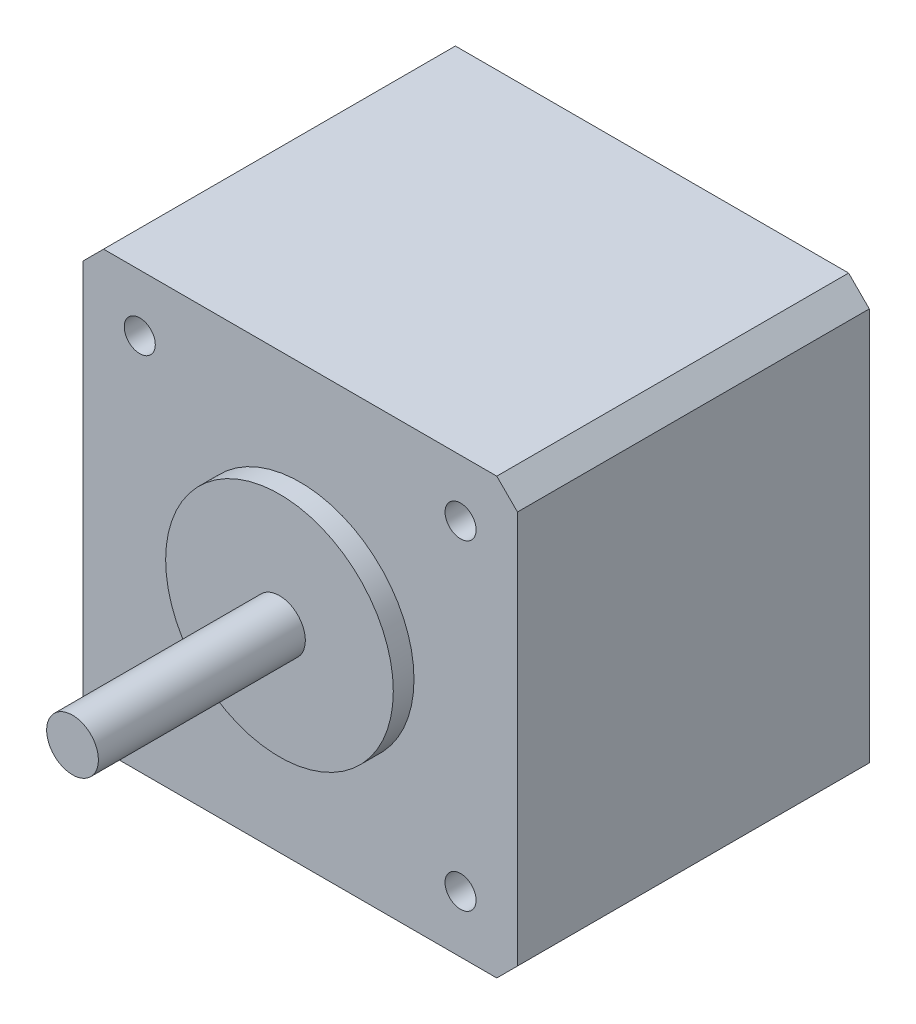
ISO-10303-21;
HEADER;
FILE_DESCRIPTION(('STEP AP214'),'2;1');
FILE_NAME('part.step','',(''),(''),'','','');
FILE_SCHEMA(('AUTOMOTIVE_DESIGN { 1 0 10303 214 1 1 1 1 }'));
ENDSEC;
DATA;
#1=APPLICATION_CONTEXT('core data for automotive mechanical design processes');
#2=APPLICATION_PROTOCOL_DEFINITION('international standard','automotive_design',2000,#1);
#3=PRODUCT_CONTEXT('',#1,'mechanical');
#4=PRODUCT('Part','Part','',(#3));
#5=PRODUCT_RELATED_PRODUCT_CATEGORY('part','',(#4));
#6=PRODUCT_DEFINITION_FORMATION('','',#4);
#7=PRODUCT_DEFINITION_CONTEXT('part definition',#1,'design');
#8=PRODUCT_DEFINITION('design','',#6,#7);
#9=PRODUCT_DEFINITION_SHAPE('','',#8);
#10=(LENGTH_UNIT() NAMED_UNIT(*) SI_UNIT(.MILLI.,.METRE.));
#11=(NAMED_UNIT(*) PLANE_ANGLE_UNIT() SI_UNIT($,.RADIAN.));
#12=(NAMED_UNIT(*) SI_UNIT($,.STERADIAN.) SOLID_ANGLE_UNIT());
#13=UNCERTAINTY_MEASURE_WITH_UNIT(LENGTH_MEASURE(1.E-05),#10,'distance_accuracy_value','');
#14=(GEOMETRIC_REPRESENTATION_CONTEXT(3) GLOBAL_UNCERTAINTY_ASSIGNED_CONTEXT((#13)) GLOBAL_UNIT_ASSIGNED_CONTEXT((#10,
#11,#12)) REPRESENTATION_CONTEXT('',''));
#15=CARTESIAN_POINT('',(0.,0.,0.));
#16=DIRECTION('',(0.,0.,1.));
#17=DIRECTION('',(1.,0.,0.));
#18=AXIS2_PLACEMENT_3D('',#15,#16,#17);
#19=CARTESIAN_POINT('',(21.,0.,-34.));
#20=DIRECTION('',(-1.,0.,0.));
#21=DIRECTION('',(0.,-1.,0.));
#22=AXIS2_PLACEMENT_3D('',#19,#20,#21);
#23=PLANE('',#22);
#24=DIRECTION('',(0.,-1.,0.));
#25=VECTOR('',#24,1.);
#26=CARTESIAN_POINT('',(21.,0.,-34.));
#27=LINE('',#26,#25);
#28=CARTESIAN_POINT('',(21.,19.,-34.));
#29=VERTEX_POINT('',#28);
#30=CARTESIAN_POINT('',(21.,-19.,-34.));
#31=VERTEX_POINT('',#30);
#32=EDGE_CURVE('E176',#29,#31,#27,.T.);
#33=ORIENTED_EDGE('',*,*,#32,.F.);
#34=DIRECTION('',(0.,0.,1.));
#35=VECTOR('',#34,1.);
#36=CARTESIAN_POINT('',(21.,19.,-34.));
#37=LINE('',#36,#35);
#38=CARTESIAN_POINT('',(21.,19.,0.));
#39=VERTEX_POINT('',#38);
#40=EDGE_CURVE('E170',#29,#39,#37,.T.);
#41=ORIENTED_EDGE('',*,*,#40,.T.);
#42=DIRECTION('',(0.,-1.,0.));
#43=VECTOR('',#42,1.);
#44=CARTESIAN_POINT('',(21.,0.,0.));
#45=LINE('',#44,#43);
#46=CARTESIAN_POINT('',(21.,-19.,0.));
#47=VERTEX_POINT('',#46);
#48=EDGE_CURVE('E135',#39,#47,#45,.T.);
#49=ORIENTED_EDGE('',*,*,#48,.T.);
#50=DIRECTION('',(0.,0.,-1.));
#51=VECTOR('',#50,1.);
#52=CARTESIAN_POINT('',(21.,-19.,-34.));
#53=LINE('',#52,#51);
#54=EDGE_CURVE('E168',#47,#31,#53,.T.);
#55=ORIENTED_EDGE('',*,*,#54,.T.);
#56=EDGE_LOOP('',(#33,#41,#49,#55));
#57=FACE_BOUND('',#56,.T.);
#58=ADVANCED_FACE('F41',(#57),#23,.F.);
#59=CARTESIAN_POINT('',(0.,-21.,-34.));
#60=DIRECTION('',(0.,-1.,0.));
#61=DIRECTION('',(0.,0.,-1.));
#62=AXIS2_PLACEMENT_3D('',#59,#60,#61);
#63=PLANE('',#62);
#64=DIRECTION('',(1.,0.,0.));
#65=VECTOR('',#64,1.);
#66=CARTESIAN_POINT('',(0.,-21.,-34.));
#67=LINE('',#66,#65);
#68=CARTESIAN_POINT('',(-19.,-21.,-34.));
#69=VERTEX_POINT('',#68);
#70=CARTESIAN_POINT('',(19.,-21.,-34.));
#71=VERTEX_POINT('',#70);
#72=EDGE_CURVE('E152',#69,#71,#67,.T.);
#73=ORIENTED_EDGE('',*,*,#72,.T.);
#74=DIRECTION('',(0.,0.,1.));
#75=VECTOR('',#74,1.);
#76=CARTESIAN_POINT('',(19.,-21.,0.));
#77=LINE('',#76,#75);
#78=CARTESIAN_POINT('',(19.,-21.,0.));
#79=VERTEX_POINT('',#78);
#80=EDGE_CURVE('E11',#71,#79,#77,.T.);
#81=ORIENTED_EDGE('',*,*,#80,.T.);
#82=DIRECTION('',(1.,0.,0.));
#83=VECTOR('',#82,1.);
#84=CARTESIAN_POINT('',(0.,-21.,0.));
#85=LINE('',#84,#83);
#86=CARTESIAN_POINT('',(-19.,-21.,0.));
#87=VERTEX_POINT('',#86);
#88=EDGE_CURVE('E137',#87,#79,#85,.T.);
#89=ORIENTED_EDGE('',*,*,#88,.F.);
#90=DIRECTION('',(0.,0.,-1.));
#91=VECTOR('',#90,1.);
#92=CARTESIAN_POINT('',(-19.,-21.,-34.));
#93=LINE('',#92,#91);
#94=EDGE_CURVE('E50',#87,#69,#93,.T.);
#95=ORIENTED_EDGE('',*,*,#94,.T.);
#96=EDGE_LOOP('',(#73,#81,#89,#95));
#97=FACE_BOUND('',#96,.T.);
#98=ADVANCED_FACE('F182',(#97),#63,.T.);
#99=CARTESIAN_POINT('',(-21.,0.,-34.));
#100=DIRECTION('',(-1.,0.,0.));
#101=DIRECTION('',(0.,-1.,0.));
#102=AXIS2_PLACEMENT_3D('',#99,#100,#101);
#103=PLANE('',#102);
#104=DIRECTION('',(0.,-1.,0.));
#105=VECTOR('',#104,1.);
#106=CARTESIAN_POINT('',(-21.,0.,0.));
#107=LINE('',#106,#105);
#108=CARTESIAN_POINT('',(-21.,19.,0.));
#109=VERTEX_POINT('',#108);
#110=CARTESIAN_POINT('',(-21.,-19.,0.));
#111=VERTEX_POINT('',#110);
#112=EDGE_CURVE('E134',#109,#111,#107,.T.);
#113=ORIENTED_EDGE('',*,*,#112,.F.);
#114=DIRECTION('',(0.,0.,-1.));
#115=VECTOR('',#114,1.);
#116=CARTESIAN_POINT('',(-21.,19.,-34.));
#117=LINE('',#116,#115);
#118=CARTESIAN_POINT('',(-21.,19.,-34.));
#119=VERTEX_POINT('',#118);
#120=EDGE_CURVE('E113',#109,#119,#117,.T.);
#121=ORIENTED_EDGE('',*,*,#120,.T.);
#122=DIRECTION('',(0.,-1.,0.));
#123=VECTOR('',#122,1.);
#124=CARTESIAN_POINT('',(-21.,0.,-34.));
#125=LINE('',#124,#123);
#126=CARTESIAN_POINT('',(-21.,-19.,-34.));
#127=VERTEX_POINT('',#126);
#128=EDGE_CURVE('E184',#119,#127,#125,.T.);
#129=ORIENTED_EDGE('',*,*,#128,.T.);
#130=DIRECTION('',(0.,0.,1.));
#131=VECTOR('',#130,1.);
#132=CARTESIAN_POINT('',(-21.,-19.,-34.));
#133=LINE('',#132,#131);
#134=EDGE_CURVE('E118',#127,#111,#133,.T.);
#135=ORIENTED_EDGE('',*,*,#134,.T.);
#136=EDGE_LOOP('',(#113,#121,#129,#135));
#137=FACE_BOUND('',#136,.T.);
#138=ADVANCED_FACE('F226',(#137),#103,.T.);
#139=CARTESIAN_POINT('',(15.5,15.5,-34.));
#140=DIRECTION('',(0.,0.,1.));
#141=DIRECTION('',(1.,0.,0.));
#142=AXIS2_PLACEMENT_3D('',#139,#140,#141);
#143=CYLINDRICAL_SURFACE('',#142,1.5);
#144=CARTESIAN_POINT('',(15.5,15.5,-34.));
#145=DIRECTION('',(0.,0.,1.));
#146=DIRECTION('',(1.,0.,0.));
#147=AXIS2_PLACEMENT_3D('',#144,#145,#146);
#148=CIRCLE('',#147,1.5);
#149=CARTESIAN_POINT('',(17.,15.5,-34.));
#150=VERTEX_POINT('',#149);
#151=EDGE_CURVE('E434',#150,#150,#148,.T.);
#152=ORIENTED_EDGE('',*,*,#151,.F.);
#153=EDGE_LOOP('',(#152));
#154=FACE_BOUND('',#153,.T.);
#155=CARTESIAN_POINT('',(15.5,15.5,0.));
#156=DIRECTION('',(0.,0.,1.));
#157=DIRECTION('',(1.,0.,0.));
#158=AXIS2_PLACEMENT_3D('',#155,#156,#157);
#159=CIRCLE('',#158,1.5);
#160=CARTESIAN_POINT('',(17.,15.5,0.));
#161=VERTEX_POINT('',#160);
#162=EDGE_CURVE('E140',#161,#161,#159,.T.);
#163=ORIENTED_EDGE('',*,*,#162,.T.);
#164=EDGE_LOOP('',(#163));
#165=FACE_BOUND('',#164,.T.);
#166=ADVANCED_FACE('F202',(#154,#165),#143,.F.);
#167=CARTESIAN_POINT('',(-15.5,15.5,-34.));
#168=DIRECTION('',(0.,0.,1.));
#169=DIRECTION('',(1.,0.,0.));
#170=AXIS2_PLACEMENT_3D('',#167,#168,#169);
#171=CYLINDRICAL_SURFACE('',#170,1.5);
#172=CARTESIAN_POINT('',(-15.5,15.5,-34.));
#173=DIRECTION('',(0.,0.,1.));
#174=DIRECTION('',(1.,0.,0.));
#175=AXIS2_PLACEMENT_3D('',#172,#173,#174);
#176=CIRCLE('',#175,1.5);
#177=CARTESIAN_POINT('',(-14.,15.5,-34.));
#178=VERTEX_POINT('',#177);
#179=EDGE_CURVE('E431',#178,#178,#176,.T.);
#180=ORIENTED_EDGE('',*,*,#179,.F.);
#181=EDGE_LOOP('',(#180));
#182=FACE_BOUND('',#181,.T.);
#183=CARTESIAN_POINT('',(-15.5,15.5,0.));
#184=DIRECTION('',(0.,0.,1.));
#185=DIRECTION('',(1.,0.,0.));
#186=AXIS2_PLACEMENT_3D('',#183,#184,#185);
#187=CIRCLE('',#186,1.5);
#188=CARTESIAN_POINT('',(-14.,15.5,0.));
#189=VERTEX_POINT('',#188);
#190=EDGE_CURVE('E197',#189,#189,#187,.T.);
#191=ORIENTED_EDGE('',*,*,#190,.T.);
#192=EDGE_LOOP('',(#191));
#193=FACE_BOUND('',#192,.T.);
#194=ADVANCED_FACE('F232',(#182,#193),#171,.F.);
#195=CARTESIAN_POINT('',(-15.5,-15.5,-34.));
#196=DIRECTION('',(0.,0.,1.));
#197=DIRECTION('',(1.,0.,0.));
#198=AXIS2_PLACEMENT_3D('',#195,#196,#197);
#199=CYLINDRICAL_SURFACE('',#198,1.5);
#200=CARTESIAN_POINT('',(-15.5,-15.5,-34.));
#201=DIRECTION('',(0.,0.,1.));
#202=DIRECTION('',(1.,0.,0.));
#203=AXIS2_PLACEMENT_3D('',#200,#201,#202);
#204=CIRCLE('',#203,1.5);
#205=CARTESIAN_POINT('',(-14.,-15.5,-34.));
#206=VERTEX_POINT('',#205);
#207=EDGE_CURVE('E428',#206,#206,#204,.T.);
#208=ORIENTED_EDGE('',*,*,#207,.F.);
#209=EDGE_LOOP('',(#208));
#210=FACE_BOUND('',#209,.T.);
#211=CARTESIAN_POINT('',(-15.5,-15.5,0.));
#212=DIRECTION('',(0.,0.,1.));
#213=DIRECTION('',(1.,0.,0.));
#214=AXIS2_PLACEMENT_3D('',#211,#212,#213);
#215=CIRCLE('',#214,1.5);
#216=CARTESIAN_POINT('',(-14.,-15.5,0.));
#217=VERTEX_POINT('',#216);
#218=EDGE_CURVE('E193',#217,#217,#215,.T.);
#219=ORIENTED_EDGE('',*,*,#218,.T.);
#220=EDGE_LOOP('',(#219));
#221=FACE_BOUND('',#220,.T.);
#222=ADVANCED_FACE('F236',(#210,#221),#199,.F.);
#223=CARTESIAN_POINT('',(15.5,-15.5,-34.));
#224=DIRECTION('',(0.,0.,1.));
#225=DIRECTION('',(1.,0.,0.));
#226=AXIS2_PLACEMENT_3D('',#223,#224,#225);
#227=CYLINDRICAL_SURFACE('',#226,1.5);
#228=CARTESIAN_POINT('',(15.5,-15.5,-34.));
#229=DIRECTION('',(0.,0.,1.));
#230=DIRECTION('',(1.,0.,0.));
#231=AXIS2_PLACEMENT_3D('',#228,#229,#230);
#232=CIRCLE('',#231,1.5);
#233=CARTESIAN_POINT('',(17.,-15.5,-34.));
#234=VERTEX_POINT('',#233);
#235=EDGE_CURVE('E146',#234,#234,#232,.T.);
#236=ORIENTED_EDGE('',*,*,#235,.F.);
#237=EDGE_LOOP('',(#236));
#238=FACE_BOUND('',#237,.T.);
#239=CARTESIAN_POINT('',(15.5,-15.5,0.));
#240=DIRECTION('',(0.,0.,1.));
#241=DIRECTION('',(1.,0.,0.));
#242=AXIS2_PLACEMENT_3D('',#239,#240,#241);
#243=CIRCLE('',#242,1.5);
#244=CARTESIAN_POINT('',(17.,-15.5,0.));
#245=VERTEX_POINT('',#244);
#246=EDGE_CURVE('E190',#245,#245,#243,.T.);
#247=ORIENTED_EDGE('',*,*,#246,.T.);
#248=EDGE_LOOP('',(#247));
#249=FACE_BOUND('',#248,.T.);
#250=ADVANCED_FACE('F240',(#238,#249),#227,.F.);
#251=CARTESIAN_POINT('',(0.,21.,-34.));
#252=DIRECTION('',(0.,-1.,0.));
#253=DIRECTION('',(0.,0.,-1.));
#254=AXIS2_PLACEMENT_3D('',#251,#252,#253);
#255=PLANE('',#254);
#256=DIRECTION('',(1.,0.,0.));
#257=VECTOR('',#256,1.);
#258=CARTESIAN_POINT('',(0.,21.,-34.));
#259=LINE('',#258,#257);
#260=CARTESIAN_POINT('',(-19.,21.,-34.));
#261=VERTEX_POINT('',#260);
#262=CARTESIAN_POINT('',(19.,21.,-34.));
#263=VERTEX_POINT('',#262);
#264=EDGE_CURVE('E128',#261,#263,#259,.T.);
#265=ORIENTED_EDGE('',*,*,#264,.F.);
#266=DIRECTION('',(0.,0.,1.));
#267=VECTOR('',#266,1.);
#268=CARTESIAN_POINT('',(-19.,21.,0.));
#269=LINE('',#268,#267);
#270=CARTESIAN_POINT('',(-19.,21.,0.));
#271=VERTEX_POINT('',#270);
#272=EDGE_CURVE('E112',#261,#271,#269,.T.);
#273=ORIENTED_EDGE('',*,*,#272,.T.);
#274=DIRECTION('',(1.,0.,0.));
#275=VECTOR('',#274,1.);
#276=CARTESIAN_POINT('',(0.,21.,0.));
#277=LINE('',#276,#275);
#278=CARTESIAN_POINT('',(19.,21.,0.));
#279=VERTEX_POINT('',#278);
#280=EDGE_CURVE('E125',#271,#279,#277,.T.);
#281=ORIENTED_EDGE('',*,*,#280,.T.);
#282=DIRECTION('',(0.,0.,-1.));
#283=VECTOR('',#282,1.);
#284=CARTESIAN_POINT('',(19.,21.,-34.));
#285=LINE('',#284,#283);
#286=EDGE_CURVE('E130',#279,#263,#285,.T.);
#287=ORIENTED_EDGE('',*,*,#286,.T.);
#288=EDGE_LOOP('',(#265,#273,#281,#287));
#289=FACE_BOUND('',#288,.T.);
#290=ADVANCED_FACE('F124',(#289),#255,.F.);
#291=CARTESIAN_POINT('',(0.,0.,-34.));
#292=DIRECTION('',(0.,0.,1.));
#293=DIRECTION('',(1.,0.,0.));
#294=AXIS2_PLACEMENT_3D('',#291,#292,#293);
#295=PLANE('',#294);
#296=ORIENTED_EDGE('',*,*,#235,.T.);
#297=EDGE_LOOP('',(#296));
#298=FACE_BOUND('',#297,.T.);
#299=ORIENTED_EDGE('',*,*,#207,.T.);
#300=EDGE_LOOP('',(#299));
#301=FACE_BOUND('',#300,.T.);
#302=ORIENTED_EDGE('',*,*,#179,.T.);
#303=EDGE_LOOP('',(#302));
#304=FACE_BOUND('',#303,.T.);
#305=ORIENTED_EDGE('',*,*,#151,.T.);
#306=EDGE_LOOP('',(#305));
#307=FACE_BOUND('',#306,.T.);
#308=ORIENTED_EDGE('',*,*,#128,.F.);
#309=DIRECTION('',(0.707106781186547,0.707106781186548,0.));
#310=VECTOR('',#309,1.);
#311=CARTESIAN_POINT('',(-19.,21.,-34.));
#312=LINE('',#311,#310);
#313=EDGE_CURVE('E166',#119,#261,#312,.T.);
#314=ORIENTED_EDGE('',*,*,#313,.T.);
#315=ORIENTED_EDGE('',*,*,#264,.T.);
#316=DIRECTION('',(-0.707106781186548,0.707106781186548,0.));
#317=VECTOR('',#316,1.);
#318=CARTESIAN_POINT('',(21.,19.,-34.));
#319=LINE('',#318,#317);
#320=EDGE_CURVE('E164',#263,#29,#319,.F.);
#321=ORIENTED_EDGE('',*,*,#320,.T.);
#322=ORIENTED_EDGE('',*,*,#32,.T.);
#323=DIRECTION('',(-0.707106781186548,-0.707106781186548,0.));
#324=VECTOR('',#323,1.);
#325=CARTESIAN_POINT('',(19.,-21.,-34.));
#326=LINE('',#325,#324);
#327=EDGE_CURVE('E57',#31,#71,#326,.T.);
#328=ORIENTED_EDGE('',*,*,#327,.T.);
#329=ORIENTED_EDGE('',*,*,#72,.F.);
#330=DIRECTION('',(0.707106781186549,-0.707106781186546,0.));
#331=VECTOR('',#330,1.);
#332=CARTESIAN_POINT('',(-21.,-19.,-34.));
#333=LINE('',#332,#331);
#334=EDGE_CURVE('E161',#69,#127,#333,.F.);
#335=ORIENTED_EDGE('',*,*,#334,.T.);
#336=EDGE_LOOP('',(#308,#314,#315,#321,#322,#328,#329,#335));
#337=FACE_BOUND('',#336,.T.);
#338=ADVANCED_FACE('F206',(#298,#301,#304,#307,#337),#295,.F.);
#339=CARTESIAN_POINT('',(0.,0.,0.));
#340=DIRECTION('',(0.,0.,1.));
#341=DIRECTION('',(1.,0.,0.));
#342=AXIS2_PLACEMENT_3D('',#339,#340,#341);
#343=PLANE('',#342);
#344=CARTESIAN_POINT('',(0.,0.,0.));
#345=DIRECTION('',(0.,0.,1.));
#346=DIRECTION('',(1.,0.,0.));
#347=AXIS2_PLACEMENT_3D('',#344,#345,#346);
#348=CIRCLE('',#347,11.);
#349=CARTESIAN_POINT('',(11.,0.,0.));
#350=VERTEX_POINT('',#349);
#351=EDGE_CURVE('E150',#350,#350,#348,.T.);
#352=ORIENTED_EDGE('',*,*,#351,.F.);
#353=EDGE_LOOP('',(#352));
#354=FACE_BOUND('',#353,.T.);
#355=ORIENTED_EDGE('',*,*,#246,.F.);
#356=EDGE_LOOP('',(#355));
#357=FACE_BOUND('',#356,.T.);
#358=ORIENTED_EDGE('',*,*,#218,.F.);
#359=EDGE_LOOP('',(#358));
#360=FACE_BOUND('',#359,.T.);
#361=ORIENTED_EDGE('',*,*,#190,.F.);
#362=EDGE_LOOP('',(#361));
#363=FACE_BOUND('',#362,.T.);
#364=ORIENTED_EDGE('',*,*,#162,.F.);
#365=EDGE_LOOP('',(#364));
#366=FACE_BOUND('',#365,.T.);
#367=ORIENTED_EDGE('',*,*,#280,.F.);
#368=DIRECTION('',(-0.707106781186547,-0.707106781186548,0.));
#369=VECTOR('',#368,1.);
#370=CARTESIAN_POINT('',(-20.,20.,0.));
#371=LINE('',#370,#369);
#372=EDGE_CURVE('E108',#271,#109,#371,.T.);
#373=ORIENTED_EDGE('',*,*,#372,.T.);
#374=ORIENTED_EDGE('',*,*,#112,.T.);
#375=DIRECTION('',(-0.707106781186549,0.707106781186546,0.));
#376=VECTOR('',#375,1.);
#377=CARTESIAN_POINT('',(-20.,-20.,0.));
#378=LINE('',#377,#376);
#379=EDGE_CURVE('E129',#111,#87,#378,.F.);
#380=ORIENTED_EDGE('',*,*,#379,.T.);
#381=ORIENTED_EDGE('',*,*,#88,.T.);
#382=DIRECTION('',(0.707106781186548,0.707106781186548,0.));
#383=VECTOR('',#382,1.);
#384=CARTESIAN_POINT('',(20.,-20.,0.));
#385=LINE('',#384,#383);
#386=EDGE_CURVE('E155',#79,#47,#385,.T.);
#387=ORIENTED_EDGE('',*,*,#386,.T.);
#388=ORIENTED_EDGE('',*,*,#48,.F.);
#389=DIRECTION('',(0.707106781186548,-0.707106781186548,0.));
#390=VECTOR('',#389,1.);
#391=CARTESIAN_POINT('',(20.,20.,0.));
#392=LINE('',#391,#390);
#393=EDGE_CURVE('E119',#39,#279,#392,.F.);
#394=ORIENTED_EDGE('',*,*,#393,.T.);
#395=EDGE_LOOP('',(#367,#373,#374,#380,#381,#387,#388,#394));
#396=FACE_BOUND('',#395,.T.);
#397=ADVANCED_FACE('F132',(#354,#357,#360,#363,#366,#396),#343,.T.);
#398=CARTESIAN_POINT('',(0.,0.,2.));
#399=DIRECTION('',(0.,0.,-1.));
#400=DIRECTION('',(-1.,0.,0.));
#401=AXIS2_PLACEMENT_3D('',#398,#399,#400);
#402=CYLINDRICAL_SURFACE('',#401,11.);
#403=CARTESIAN_POINT('',(0.,0.,2.));
#404=DIRECTION('',(0.,0.,1.));
#405=DIRECTION('',(1.,0.,0.));
#406=AXIS2_PLACEMENT_3D('',#403,#404,#405);
#407=CIRCLE('',#406,11.);
#408=CARTESIAN_POINT('',(11.,0.,2.));
#409=VERTEX_POINT('',#408);
#410=EDGE_CURVE('E194',#409,#409,#407,.T.);
#411=ORIENTED_EDGE('',*,*,#410,.F.);
#412=EDGE_LOOP('',(#411));
#413=FACE_BOUND('',#412,.T.);
#414=ORIENTED_EDGE('',*,*,#351,.T.);
#415=EDGE_LOOP('',(#414));
#416=FACE_BOUND('',#415,.T.);
#417=ADVANCED_FACE('F205',(#413,#416),#402,.T.);
#418=CARTESIAN_POINT('',(0.,0.,2.));
#419=DIRECTION('',(0.,0.,1.));
#420=DIRECTION('',(1.,0.,0.));
#421=AXIS2_PLACEMENT_3D('',#418,#419,#420);
#422=PLANE('',#421);
#423=CARTESIAN_POINT('',(0.,0.,2.));
#424=DIRECTION('',(0.,0.,1.));
#425=DIRECTION('',(1.,0.,0.));
#426=AXIS2_PLACEMENT_3D('',#423,#424,#425);
#427=CIRCLE('',#426,2.5);
#428=CARTESIAN_POINT('',(2.5,0.,2.));
#429=VERTEX_POINT('',#428);
#430=EDGE_CURVE('E147',#429,#429,#427,.F.);
#431=ORIENTED_EDGE('',*,*,#430,.T.);
#432=EDGE_LOOP('',(#431));
#433=FACE_BOUND('',#432,.T.);
#434=ORIENTED_EDGE('',*,*,#410,.T.);
#435=EDGE_LOOP('',(#434));
#436=FACE_BOUND('',#435,.T.);
#437=ADVANCED_FACE('F213',(#433,#436),#422,.T.);
#438=CARTESIAN_POINT('',(0.,0.,22.));
#439=DIRECTION('',(0.,0.,-1.));
#440=DIRECTION('',(-1.,0.,0.));
#441=AXIS2_PLACEMENT_3D('',#438,#439,#440);
#442=CYLINDRICAL_SURFACE('',#441,2.5);
#443=ORIENTED_EDGE('',*,*,#430,.F.);
#444=EDGE_LOOP('',(#443));
#445=FACE_BOUND('',#444,.T.);
#446=CARTESIAN_POINT('',(0.,0.,22.));
#447=DIRECTION('',(0.,0.,1.));
#448=DIRECTION('',(1.,0.,0.));
#449=AXIS2_PLACEMENT_3D('',#446,#447,#448);
#450=CIRCLE('',#449,2.5);
#451=CARTESIAN_POINT('',(2.5,0.,22.));
#452=VERTEX_POINT('',#451);
#453=EDGE_CURVE('E151',#452,#452,#450,.T.);
#454=ORIENTED_EDGE('',*,*,#453,.F.);
#455=EDGE_LOOP('',(#454));
#456=FACE_BOUND('',#455,.T.);
#457=ADVANCED_FACE('F344',(#445,#456),#442,.T.);
#458=CARTESIAN_POINT('',(0.,0.,22.));
#459=DIRECTION('',(0.,0.,1.));
#460=DIRECTION('',(1.,0.,0.));
#461=AXIS2_PLACEMENT_3D('',#458,#459,#460);
#462=PLANE('',#461);
#463=ORIENTED_EDGE('',*,*,#453,.T.);
#464=EDGE_LOOP('',(#463));
#465=FACE_BOUND('',#464,.T.);
#466=ADVANCED_FACE('F252',(#465),#462,.T.);
#467=CARTESIAN_POINT('',(-19.,21.,-34.));
#468=DIRECTION('',(-0.707106781186548,0.707106781186547,0.));
#469=DIRECTION('',(0.,0.,-1.));
#470=AXIS2_PLACEMENT_3D('',#467,#468,#469);
#471=PLANE('',#470);
#472=ORIENTED_EDGE('',*,*,#313,.F.);
#473=ORIENTED_EDGE('',*,*,#120,.F.);
#474=ORIENTED_EDGE('',*,*,#372,.F.);
#475=ORIENTED_EDGE('',*,*,#272,.F.);
#476=EDGE_LOOP('',(#472,#473,#474,#475));
#477=FACE_BOUND('',#476,.T.);
#478=ADVANCED_FACE('F111',(#477),#471,.T.);
#479=CARTESIAN_POINT('',(21.,19.,-34.));
#480=DIRECTION('',(-0.707106781186548,-0.707106781186548,0.));
#481=DIRECTION('',(0.,0.,1.));
#482=AXIS2_PLACEMENT_3D('',#479,#480,#481);
#483=PLANE('',#482);
#484=ORIENTED_EDGE('',*,*,#320,.F.);
#485=ORIENTED_EDGE('',*,*,#286,.F.);
#486=ORIENTED_EDGE('',*,*,#393,.F.);
#487=ORIENTED_EDGE('',*,*,#40,.F.);
#488=EDGE_LOOP('',(#484,#485,#486,#487));
#489=FACE_BOUND('',#488,.T.);
#490=ADVANCED_FACE('F251',(#489),#483,.F.);
#491=CARTESIAN_POINT('',(19.,-21.,-34.));
#492=DIRECTION('',(0.707106781186547,-0.707106781186547,0.));
#493=DIRECTION('',(0.,0.,-1.));
#494=AXIS2_PLACEMENT_3D('',#491,#492,#493);
#495=PLANE('',#494);
#496=ORIENTED_EDGE('',*,*,#327,.F.);
#497=ORIENTED_EDGE('',*,*,#54,.F.);
#498=ORIENTED_EDGE('',*,*,#386,.F.);
#499=ORIENTED_EDGE('',*,*,#80,.F.);
#500=EDGE_LOOP('',(#496,#497,#498,#499));
#501=FACE_BOUND('',#500,.T.);
#502=ADVANCED_FACE('F181',(#501),#495,.T.);
#503=CARTESIAN_POINT('',(-21.,-19.,-34.));
#504=DIRECTION('',(0.707106781186546,0.707106781186549,0.));
#505=DIRECTION('',(0.,0.,1.));
#506=AXIS2_PLACEMENT_3D('',#503,#504,#505);
#507=PLANE('',#506);
#508=ORIENTED_EDGE('',*,*,#334,.F.);
#509=ORIENTED_EDGE('',*,*,#94,.F.);
#510=ORIENTED_EDGE('',*,*,#379,.F.);
#511=ORIENTED_EDGE('',*,*,#134,.F.);
#512=EDGE_LOOP('',(#508,#509,#510,#511));
#513=FACE_BOUND('',#512,.T.);
#514=ADVANCED_FACE('F44',(#513),#507,.F.);
#515=CLOSED_SHELL('',(#58,#98,#138,#166,#194,#222,#250,#290,#338,#397,#417,#437,#457,#466,#478,
#490,#502,#514));
#516=MANIFOLD_SOLID_BREP('B2',#515);
#517=ADVANCED_BREP_SHAPE_REPRESENTATION('',(#18,#516),#14);
#518=SHAPE_DEFINITION_REPRESENTATION(#9,#517);
ENDSEC;
END-ISO-10303-21;
